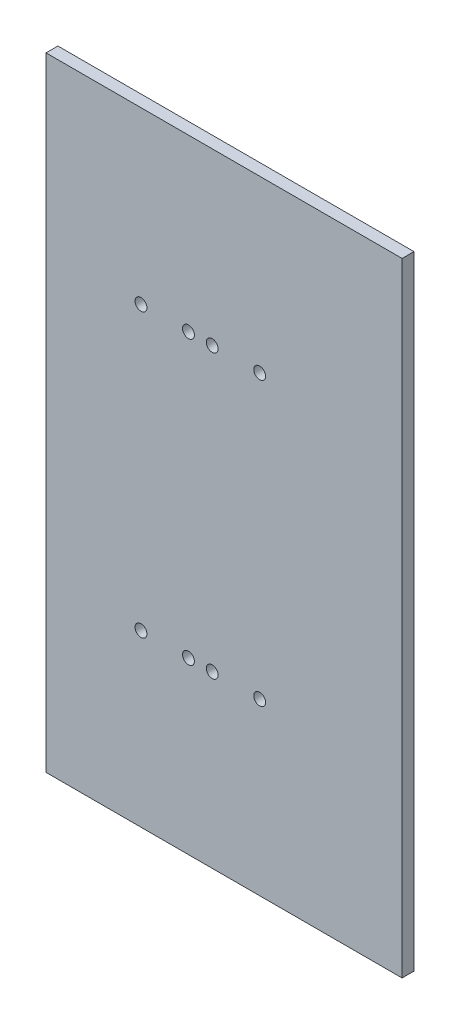
ISO-10303-21;
HEADER;
FILE_DESCRIPTION(('STEP AP214'),'2;1');
FILE_NAME('part.step','',(''),(''),'','','');
FILE_SCHEMA(('AUTOMOTIVE_DESIGN { 1 0 10303 214 1 1 1 1 }'));
ENDSEC;
DATA;
#1=APPLICATION_CONTEXT('core data for automotive mechanical design processes');
#2=APPLICATION_PROTOCOL_DEFINITION('international standard','automotive_design',2000,#1);
#3=PRODUCT_CONTEXT('',#1,'mechanical');
#4=PRODUCT('Part','Part','',(#3));
#5=PRODUCT_RELATED_PRODUCT_CATEGORY('part','',(#4));
#6=PRODUCT_DEFINITION_FORMATION('','',#4);
#7=PRODUCT_DEFINITION_CONTEXT('part definition',#1,'design');
#8=PRODUCT_DEFINITION('design','',#6,#7);
#9=PRODUCT_DEFINITION_SHAPE('','',#8);
#10=(LENGTH_UNIT() NAMED_UNIT(*) SI_UNIT(.MILLI.,.METRE.));
#11=(NAMED_UNIT(*) PLANE_ANGLE_UNIT() SI_UNIT($,.RADIAN.));
#12=(NAMED_UNIT(*) SI_UNIT($,.STERADIAN.) SOLID_ANGLE_UNIT());
#13=UNCERTAINTY_MEASURE_WITH_UNIT(LENGTH_MEASURE(1.E-05),#10,'distance_accuracy_value','');
#14=(GEOMETRIC_REPRESENTATION_CONTEXT(3) GLOBAL_UNCERTAINTY_ASSIGNED_CONTEXT((#13)) GLOBAL_UNIT_ASSIGNED_CONTEXT((#10,
#11,#12)) REPRESENTATION_CONTEXT('',''));
#15=CARTESIAN_POINT('',(0.,0.,0.));
#16=DIRECTION('',(0.,0.,1.));
#17=DIRECTION('',(1.,0.,0.));
#18=AXIS2_PLACEMENT_3D('',#15,#16,#17);
#19=CARTESIAN_POINT('',(0.,0.,2.));
#20=DIRECTION('',(0.,0.,1.));
#21=DIRECTION('',(1.,0.,0.));
#22=AXIS2_PLACEMENT_3D('',#19,#20,#21);
#23=PLANE('',#22);
#24=CARTESIAN_POINT('',(-8.97183195623916,-33.2874476987448,2.));
#25=DIRECTION('',(0.,0.,1.));
#26=DIRECTION('',(1.,0.,0.));
#27=AXIS2_PLACEMENT_3D('',#24,#25,#26);
#28=CIRCLE('',#27,1.);
#29=CARTESIAN_POINT('',(-7.97183195623916,-33.2874476987448,2.));
#30=VERTEX_POINT('',#29);
#31=EDGE_CURVE('E144',#30,#30,#28,.T.);
#32=ORIENTED_EDGE('',*,*,#31,.F.);
#33=EDGE_LOOP('',(#32));
#34=FACE_BOUND('',#33,.T.);
#35=CARTESIAN_POINT('',(-8.97183195623916,14.3125523012552,2.));
#36=DIRECTION('',(0.,0.,1.));
#37=DIRECTION('',(1.,0.,0.));
#38=AXIS2_PLACEMENT_3D('',#35,#36,#37);
#39=CIRCLE('',#38,1.);
#40=CARTESIAN_POINT('',(-7.97183195623916,14.3125523012552,2.));
#41=VERTEX_POINT('',#40);
#42=EDGE_CURVE('E132',#41,#41,#39,.T.);
#43=ORIENTED_EDGE('',*,*,#42,.F.);
#44=EDGE_LOOP('',(#43));
#45=FACE_BOUND('',#44,.T.);
#46=CARTESIAN_POINT('',(-12.9718319562392,-33.2874476987448,2.));
#47=DIRECTION('',(0.,0.,1.));
#48=DIRECTION('',(1.,0.,0.));
#49=AXIS2_PLACEMENT_3D('',#46,#47,#48);
#50=CIRCLE('',#49,1.);
#51=CARTESIAN_POINT('',(-11.9718319562392,-33.2874476987448,2.));
#52=VERTEX_POINT('',#51);
#53=EDGE_CURVE('E120',#52,#52,#50,.T.);
#54=ORIENTED_EDGE('',*,*,#53,.F.);
#55=EDGE_LOOP('',(#54));
#56=FACE_BOUND('',#55,.T.);
#57=CARTESIAN_POINT('',(-20.9718319562391,-33.2874476987448,2.));
#58=DIRECTION('',(0.,0.,1.));
#59=DIRECTION('',(1.,0.,0.));
#60=AXIS2_PLACEMENT_3D('',#57,#58,#59);
#61=CIRCLE('',#60,1.00000000000001);
#62=CARTESIAN_POINT('',(-19.9718319562391,-33.2874476987448,2.));
#63=VERTEX_POINT('',#62);
#64=EDGE_CURVE('E99',#63,#63,#61,.T.);
#65=ORIENTED_EDGE('',*,*,#64,.F.);
#66=EDGE_LOOP('',(#65));
#67=FACE_BOUND('',#66,.T.);
#68=DIRECTION('',(0.,-1.,0.));
#69=VECTOR('',#68,1.);
#70=CARTESIAN_POINT('',(-36.9718319562392,43.0125523012552,2.));
#71=LINE('',#70,#69);
#72=CARTESIAN_POINT('',(-36.9718319562392,43.0125523012552,2.));
#73=VERTEX_POINT('',#72);
#74=CARTESIAN_POINT('',(-36.9718319562392,-61.9874476987448,2.));
#75=VERTEX_POINT('',#74);
#76=EDGE_CURVE('E84',#73,#75,#71,.T.);
#77=ORIENTED_EDGE('',*,*,#76,.T.);
#78=DIRECTION('',(1.,0.,0.));
#79=VECTOR('',#78,1.);
#80=CARTESIAN_POINT('',(-36.9718319562392,-61.9874476987448,2.));
#81=LINE('',#80,#79);
#82=CARTESIAN_POINT('',(23.0281680437608,-61.9874476987448,2.));
#83=VERTEX_POINT('',#82);
#84=EDGE_CURVE('E79',#75,#83,#81,.T.);
#85=ORIENTED_EDGE('',*,*,#84,.T.);
#86=DIRECTION('',(0.,1.,0.));
#87=VECTOR('',#86,1.);
#88=CARTESIAN_POINT('',(23.0281680437608,43.0125523012552,2.));
#89=LINE('',#88,#87);
#90=CARTESIAN_POINT('',(23.0281680437608,43.0125523012552,2.));
#91=VERTEX_POINT('',#90);
#92=EDGE_CURVE('E82',#83,#91,#89,.T.);
#93=ORIENTED_EDGE('',*,*,#92,.T.);
#94=DIRECTION('',(-1.,0.,0.));
#95=VECTOR('',#94,1.);
#96=CARTESIAN_POINT('',(-36.9718319562392,43.0125523012552,2.));
#97=LINE('',#96,#95);
#98=EDGE_CURVE('E49',#91,#73,#97,.T.);
#99=ORIENTED_EDGE('',*,*,#98,.T.);
#100=EDGE_LOOP('',(#77,#85,#93,#99));
#101=FACE_BOUND('',#100,.T.);
#102=CARTESIAN_POINT('',(-20.9718319562391,14.3125523012552,2.));
#103=DIRECTION('',(0.,0.,1.));
#104=DIRECTION('',(1.,0.,0.));
#105=AXIS2_PLACEMENT_3D('',#102,#103,#104);
#106=CIRCLE('',#105,1.00000000000001);
#107=CARTESIAN_POINT('',(-19.9718319562391,14.3125523012552,2.));
#108=VERTEX_POINT('',#107);
#109=EDGE_CURVE('E114',#108,#108,#106,.T.);
#110=ORIENTED_EDGE('',*,*,#109,.F.);
#111=EDGE_LOOP('',(#110));
#112=FACE_BOUND('',#111,.T.);
#113=CARTESIAN_POINT('',(-12.9718319562392,14.3125523012552,2.));
#114=DIRECTION('',(0.,0.,1.));
#115=DIRECTION('',(1.,0.,0.));
#116=AXIS2_PLACEMENT_3D('',#113,#114,#115);
#117=CIRCLE('',#116,1.);
#118=CARTESIAN_POINT('',(-11.9718319562392,14.3125523012552,2.));
#119=VERTEX_POINT('',#118);
#120=EDGE_CURVE('E126',#119,#119,#117,.T.);
#121=ORIENTED_EDGE('',*,*,#120,.F.);
#122=EDGE_LOOP('',(#121));
#123=FACE_BOUND('',#122,.T.);
#124=CARTESIAN_POINT('',(-0.971831956239179,14.3125523012552,2.));
#125=DIRECTION('',(0.,0.,1.));
#126=DIRECTION('',(1.,0.,0.));
#127=AXIS2_PLACEMENT_3D('',#124,#125,#126);
#128=CIRCLE('',#127,1.);
#129=CARTESIAN_POINT('',(0.0281680437608234,14.3125523012552,2.));
#130=VERTEX_POINT('',#129);
#131=EDGE_CURVE('E138',#130,#130,#128,.T.);
#132=ORIENTED_EDGE('',*,*,#131,.F.);
#133=EDGE_LOOP('',(#132));
#134=FACE_BOUND('',#133,.T.);
#135=CARTESIAN_POINT('',(-0.971831956239179,-33.2874476987448,2.));
#136=DIRECTION('',(0.,0.,1.));
#137=DIRECTION('',(1.,0.,0.));
#138=AXIS2_PLACEMENT_3D('',#135,#136,#137);
#139=CIRCLE('',#138,1.);
#140=CARTESIAN_POINT('',(0.0281680437608234,-33.2874476987448,2.));
#141=VERTEX_POINT('',#140);
#142=EDGE_CURVE('E150',#141,#141,#139,.T.);
#143=ORIENTED_EDGE('',*,*,#142,.F.);
#144=EDGE_LOOP('',(#143));
#145=FACE_BOUND('',#144,.T.);
#146=ADVANCED_FACE('F32',(#34,#45,#56,#67,#101,#112,#123,#134,#145),#23,.T.);
#147=CARTESIAN_POINT('',(0.,0.,0.));
#148=DIRECTION('',(0.,0.,1.));
#149=DIRECTION('',(1.,0.,0.));
#150=AXIS2_PLACEMENT_3D('',#147,#148,#149);
#151=PLANE('',#150);
#152=DIRECTION('',(0.,-1.,0.));
#153=VECTOR('',#152,1.);
#154=CARTESIAN_POINT('',(-36.9718319562392,43.0125523012552,0.));
#155=LINE('',#154,#153);
#156=CARTESIAN_POINT('',(-36.9718319562392,43.0125523012552,0.));
#157=VERTEX_POINT('',#156);
#158=CARTESIAN_POINT('',(-36.9718319562392,-61.9874476987448,0.));
#159=VERTEX_POINT('',#158);
#160=EDGE_CURVE('E96',#157,#159,#155,.T.);
#161=ORIENTED_EDGE('',*,*,#160,.F.);
#162=DIRECTION('',(-1.,0.,0.));
#163=VECTOR('',#162,1.);
#164=CARTESIAN_POINT('',(-36.9718319562392,43.0125523012552,0.));
#165=LINE('',#164,#163);
#166=CARTESIAN_POINT('',(23.0281680437608,43.0125523012552,0.));
#167=VERTEX_POINT('',#166);
#168=EDGE_CURVE('E72',#167,#157,#165,.T.);
#169=ORIENTED_EDGE('',*,*,#168,.F.);
#170=DIRECTION('',(0.,1.,0.));
#171=VECTOR('',#170,1.);
#172=CARTESIAN_POINT('',(23.0281680437608,43.0125523012552,0.));
#173=LINE('',#172,#171);
#174=CARTESIAN_POINT('',(23.0281680437608,-61.9874476987448,0.));
#175=VERTEX_POINT('',#174);
#176=EDGE_CURVE('E66',#175,#167,#173,.T.);
#177=ORIENTED_EDGE('',*,*,#176,.F.);
#178=DIRECTION('',(1.,0.,0.));
#179=VECTOR('',#178,1.);
#180=CARTESIAN_POINT('',(-36.9718319562392,-61.9874476987448,0.));
#181=LINE('',#180,#179);
#182=EDGE_CURVE('E88',#159,#175,#181,.T.);
#183=ORIENTED_EDGE('',*,*,#182,.F.);
#184=EDGE_LOOP('',(#161,#169,#177,#183));
#185=FACE_BOUND('',#184,.T.);
#186=CARTESIAN_POINT('',(-20.9718319562391,-33.2874476987448,0.));
#187=DIRECTION('',(0.,0.,1.));
#188=DIRECTION('',(1.,0.,0.));
#189=AXIS2_PLACEMENT_3D('',#186,#187,#188);
#190=CIRCLE('',#189,1.00000000000001);
#191=CARTESIAN_POINT('',(-19.9718319562391,-33.2874476987448,0.));
#192=VERTEX_POINT('',#191);
#193=EDGE_CURVE('E111',#192,#192,#190,.T.);
#194=ORIENTED_EDGE('',*,*,#193,.T.);
#195=EDGE_LOOP('',(#194));
#196=FACE_BOUND('',#195,.T.);
#197=CARTESIAN_POINT('',(-20.9718319562391,14.3125523012552,0.));
#198=DIRECTION('',(0.,0.,1.));
#199=DIRECTION('',(1.,0.,0.));
#200=AXIS2_PLACEMENT_3D('',#197,#198,#199);
#201=CIRCLE('',#200,1.00000000000001);
#202=CARTESIAN_POINT('',(-19.9718319562391,14.3125523012552,0.));
#203=VERTEX_POINT('',#202);
#204=EDGE_CURVE('E117',#203,#203,#201,.T.);
#205=ORIENTED_EDGE('',*,*,#204,.T.);
#206=EDGE_LOOP('',(#205));
#207=FACE_BOUND('',#206,.T.);
#208=CARTESIAN_POINT('',(-12.9718319562392,-33.2874476987448,0.));
#209=DIRECTION('',(0.,0.,1.));
#210=DIRECTION('',(1.,0.,0.));
#211=AXIS2_PLACEMENT_3D('',#208,#209,#210);
#212=CIRCLE('',#211,1.);
#213=CARTESIAN_POINT('',(-11.9718319562392,-33.2874476987448,0.));
#214=VERTEX_POINT('',#213);
#215=EDGE_CURVE('E123',#214,#214,#212,.T.);
#216=ORIENTED_EDGE('',*,*,#215,.T.);
#217=EDGE_LOOP('',(#216));
#218=FACE_BOUND('',#217,.T.);
#219=CARTESIAN_POINT('',(-12.9718319562392,14.3125523012552,0.));
#220=DIRECTION('',(0.,0.,1.));
#221=DIRECTION('',(1.,0.,0.));
#222=AXIS2_PLACEMENT_3D('',#219,#220,#221);
#223=CIRCLE('',#222,1.);
#224=CARTESIAN_POINT('',(-11.9718319562392,14.3125523012552,0.));
#225=VERTEX_POINT('',#224);
#226=EDGE_CURVE('E129',#225,#225,#223,.T.);
#227=ORIENTED_EDGE('',*,*,#226,.T.);
#228=EDGE_LOOP('',(#227));
#229=FACE_BOUND('',#228,.T.);
#230=CARTESIAN_POINT('',(-8.97183195623916,14.3125523012552,0.));
#231=DIRECTION('',(0.,0.,1.));
#232=DIRECTION('',(1.,0.,0.));
#233=AXIS2_PLACEMENT_3D('',#230,#231,#232);
#234=CIRCLE('',#233,1.);
#235=CARTESIAN_POINT('',(-7.97183195623916,14.3125523012552,0.));
#236=VERTEX_POINT('',#235);
#237=EDGE_CURVE('E135',#236,#236,#234,.T.);
#238=ORIENTED_EDGE('',*,*,#237,.T.);
#239=EDGE_LOOP('',(#238));
#240=FACE_BOUND('',#239,.T.);
#241=CARTESIAN_POINT('',(-0.971831956239179,14.3125523012552,0.));
#242=DIRECTION('',(0.,0.,1.));
#243=DIRECTION('',(1.,0.,0.));
#244=AXIS2_PLACEMENT_3D('',#241,#242,#243);
#245=CIRCLE('',#244,1.);
#246=CARTESIAN_POINT('',(0.0281680437608234,14.3125523012552,0.));
#247=VERTEX_POINT('',#246);
#248=EDGE_CURVE('E141',#247,#247,#245,.T.);
#249=ORIENTED_EDGE('',*,*,#248,.T.);
#250=EDGE_LOOP('',(#249));
#251=FACE_BOUND('',#250,.T.);
#252=CARTESIAN_POINT('',(-8.97183195623916,-33.2874476987448,0.));
#253=DIRECTION('',(0.,0.,1.));
#254=DIRECTION('',(1.,0.,0.));
#255=AXIS2_PLACEMENT_3D('',#252,#253,#254);
#256=CIRCLE('',#255,1.);
#257=CARTESIAN_POINT('',(-7.97183195623916,-33.2874476987448,0.));
#258=VERTEX_POINT('',#257);
#259=EDGE_CURVE('E147',#258,#258,#256,.T.);
#260=ORIENTED_EDGE('',*,*,#259,.T.);
#261=EDGE_LOOP('',(#260));
#262=FACE_BOUND('',#261,.T.);
#263=CARTESIAN_POINT('',(-0.971831956239179,-33.2874476987448,0.));
#264=DIRECTION('',(0.,0.,1.));
#265=DIRECTION('',(1.,0.,0.));
#266=AXIS2_PLACEMENT_3D('',#263,#264,#265);
#267=CIRCLE('',#266,1.);
#268=CARTESIAN_POINT('',(0.0281680437608234,-33.2874476987448,0.));
#269=VERTEX_POINT('',#268);
#270=EDGE_CURVE('E153',#269,#269,#267,.T.);
#271=ORIENTED_EDGE('',*,*,#270,.T.);
#272=EDGE_LOOP('',(#271));
#273=FACE_BOUND('',#272,.T.);
#274=ADVANCED_FACE('F107',(#185,#196,#207,#218,#229,#240,#251,#262,#273),#151,.F.);
#275=CARTESIAN_POINT('',(-36.9718319562392,43.0125523012552,2.));
#276=DIRECTION('',(1.,0.,0.));
#277=DIRECTION('',(0.,0.,-1.));
#278=AXIS2_PLACEMENT_3D('',#275,#276,#277);
#279=PLANE('',#278);
#280=ORIENTED_EDGE('',*,*,#160,.T.);
#281=DIRECTION('',(0.,0.,-1.));
#282=VECTOR('',#281,1.);
#283=CARTESIAN_POINT('',(-36.9718319562392,-61.9874476987448,2.));
#284=LINE('',#283,#282);
#285=EDGE_CURVE('E11',#75,#159,#284,.T.);
#286=ORIENTED_EDGE('',*,*,#285,.F.);
#287=ORIENTED_EDGE('',*,*,#76,.F.);
#288=DIRECTION('',(0.,0.,-1.));
#289=VECTOR('',#288,1.);
#290=CARTESIAN_POINT('',(-36.9718319562392,43.0125523012552,2.));
#291=LINE('',#290,#289);
#292=EDGE_CURVE('E92',#73,#157,#291,.T.);
#293=ORIENTED_EDGE('',*,*,#292,.T.);
#294=EDGE_LOOP('',(#280,#286,#287,#293));
#295=FACE_BOUND('',#294,.T.);
#296=ADVANCED_FACE('F34',(#295),#279,.F.);
#297=CARTESIAN_POINT('',(-36.9718319562392,-61.9874476987448,2.));
#298=DIRECTION('',(0.,1.,0.));
#299=DIRECTION('',(0.,0.,1.));
#300=AXIS2_PLACEMENT_3D('',#297,#298,#299);
#301=PLANE('',#300);
#302=ORIENTED_EDGE('',*,*,#182,.T.);
#303=DIRECTION('',(0.,0.,-1.));
#304=VECTOR('',#303,1.);
#305=CARTESIAN_POINT('',(23.0281680437608,-61.9874476987448,2.));
#306=LINE('',#305,#304);
#307=EDGE_CURVE('E41',#83,#175,#306,.T.);
#308=ORIENTED_EDGE('',*,*,#307,.F.);
#309=ORIENTED_EDGE('',*,*,#84,.F.);
#310=ORIENTED_EDGE('',*,*,#285,.T.);
#311=EDGE_LOOP('',(#302,#308,#309,#310));
#312=FACE_BOUND('',#311,.T.);
#313=ADVANCED_FACE('F87',(#312),#301,.F.);
#314=CARTESIAN_POINT('',(23.0281680437608,43.0125523012552,2.));
#315=DIRECTION('',(-1.,0.,0.));
#316=DIRECTION('',(0.,0.,1.));
#317=AXIS2_PLACEMENT_3D('',#314,#315,#316);
#318=PLANE('',#317);
#319=ORIENTED_EDGE('',*,*,#176,.T.);
#320=DIRECTION('',(0.,0.,-1.));
#321=VECTOR('',#320,1.);
#322=CARTESIAN_POINT('',(23.0281680437608,43.0125523012552,2.));
#323=LINE('',#322,#321);
#324=EDGE_CURVE('E89',#91,#167,#323,.T.);
#325=ORIENTED_EDGE('',*,*,#324,.F.);
#326=ORIENTED_EDGE('',*,*,#92,.F.);
#327=ORIENTED_EDGE('',*,*,#307,.T.);
#328=EDGE_LOOP('',(#319,#325,#326,#327));
#329=FACE_BOUND('',#328,.T.);
#330=ADVANCED_FACE('F90',(#329),#318,.F.);
#331=CARTESIAN_POINT('',(-36.9718319562392,43.0125523012552,2.));
#332=DIRECTION('',(0.,-1.,0.));
#333=DIRECTION('',(0.,0.,-1.));
#334=AXIS2_PLACEMENT_3D('',#331,#332,#333);
#335=PLANE('',#334);
#336=ORIENTED_EDGE('',*,*,#168,.T.);
#337=ORIENTED_EDGE('',*,*,#292,.F.);
#338=ORIENTED_EDGE('',*,*,#98,.F.);
#339=ORIENTED_EDGE('',*,*,#324,.T.);
#340=EDGE_LOOP('',(#336,#337,#338,#339));
#341=FACE_BOUND('',#340,.T.);
#342=ADVANCED_FACE('F104',(#341),#335,.F.);
#343=CARTESIAN_POINT('',(-20.9718319562391,-33.2874476987448,2.));
#344=DIRECTION('',(0.,0.,-1.));
#345=DIRECTION('',(-1.,0.,0.));
#346=AXIS2_PLACEMENT_3D('',#343,#344,#345);
#347=CYLINDRICAL_SURFACE('',#346,1.00000000000001);
#348=ORIENTED_EDGE('',*,*,#64,.T.);
#349=EDGE_LOOP('',(#348));
#350=FACE_BOUND('',#349,.T.);
#351=ORIENTED_EDGE('',*,*,#193,.F.);
#352=EDGE_LOOP('',(#351));
#353=FACE_BOUND('',#352,.T.);
#354=ADVANCED_FACE('F172',(#350,#353),#347,.F.);
#355=CARTESIAN_POINT('',(-20.9718319562391,14.3125523012552,2.));
#356=DIRECTION('',(0.,0.,-1.));
#357=DIRECTION('',(-1.,0.,0.));
#358=AXIS2_PLACEMENT_3D('',#355,#356,#357);
#359=CYLINDRICAL_SURFACE('',#358,1.00000000000001);
#360=ORIENTED_EDGE('',*,*,#109,.T.);
#361=EDGE_LOOP('',(#360));
#362=FACE_BOUND('',#361,.T.);
#363=ORIENTED_EDGE('',*,*,#204,.F.);
#364=EDGE_LOOP('',(#363));
#365=FACE_BOUND('',#364,.T.);
#366=ADVANCED_FACE('F218',(#362,#365),#359,.F.);
#367=CARTESIAN_POINT('',(-12.9718319562392,-33.2874476987448,2.));
#368=DIRECTION('',(0.,0.,-1.));
#369=DIRECTION('',(-1.,0.,0.));
#370=AXIS2_PLACEMENT_3D('',#367,#368,#369);
#371=CYLINDRICAL_SURFACE('',#370,1.);
#372=ORIENTED_EDGE('',*,*,#53,.T.);
#373=EDGE_LOOP('',(#372));
#374=FACE_BOUND('',#373,.T.);
#375=ORIENTED_EDGE('',*,*,#215,.F.);
#376=EDGE_LOOP('',(#375));
#377=FACE_BOUND('',#376,.T.);
#378=ADVANCED_FACE('F226',(#374,#377),#371,.F.);
#379=CARTESIAN_POINT('',(-12.9718319562392,14.3125523012552,2.));
#380=DIRECTION('',(0.,0.,-1.));
#381=DIRECTION('',(-1.,0.,0.));
#382=AXIS2_PLACEMENT_3D('',#379,#380,#381);
#383=CYLINDRICAL_SURFACE('',#382,1.);
#384=ORIENTED_EDGE('',*,*,#120,.T.);
#385=EDGE_LOOP('',(#384));
#386=FACE_BOUND('',#385,.T.);
#387=ORIENTED_EDGE('',*,*,#226,.F.);
#388=EDGE_LOOP('',(#387));
#389=FACE_BOUND('',#388,.T.);
#390=ADVANCED_FACE('F234',(#386,#389),#383,.F.);
#391=CARTESIAN_POINT('',(-8.97183195623916,14.3125523012552,2.));
#392=DIRECTION('',(0.,0.,-1.));
#393=DIRECTION('',(-1.,0.,0.));
#394=AXIS2_PLACEMENT_3D('',#391,#392,#393);
#395=CYLINDRICAL_SURFACE('',#394,1.);
#396=ORIENTED_EDGE('',*,*,#42,.T.);
#397=EDGE_LOOP('',(#396));
#398=FACE_BOUND('',#397,.T.);
#399=ORIENTED_EDGE('',*,*,#237,.F.);
#400=EDGE_LOOP('',(#399));
#401=FACE_BOUND('',#400,.T.);
#402=ADVANCED_FACE('F243',(#398,#401),#395,.F.);
#403=CARTESIAN_POINT('',(-0.971831956239179,14.3125523012552,2.));
#404=DIRECTION('',(0.,0.,-1.));
#405=DIRECTION('',(-1.,0.,0.));
#406=AXIS2_PLACEMENT_3D('',#403,#404,#405);
#407=CYLINDRICAL_SURFACE('',#406,1.);
#408=ORIENTED_EDGE('',*,*,#131,.T.);
#409=EDGE_LOOP('',(#408));
#410=FACE_BOUND('',#409,.T.);
#411=ORIENTED_EDGE('',*,*,#248,.F.);
#412=EDGE_LOOP('',(#411));
#413=FACE_BOUND('',#412,.T.);
#414=ADVANCED_FACE('F252',(#410,#413),#407,.F.);
#415=CARTESIAN_POINT('',(-8.97183195623916,-33.2874476987448,2.));
#416=DIRECTION('',(0.,0.,-1.));
#417=DIRECTION('',(-1.,0.,0.));
#418=AXIS2_PLACEMENT_3D('',#415,#416,#417);
#419=CYLINDRICAL_SURFACE('',#418,1.);
#420=ORIENTED_EDGE('',*,*,#31,.T.);
#421=EDGE_LOOP('',(#420));
#422=FACE_BOUND('',#421,.T.);
#423=ORIENTED_EDGE('',*,*,#259,.F.);
#424=EDGE_LOOP('',(#423));
#425=FACE_BOUND('',#424,.T.);
#426=ADVANCED_FACE('F261',(#422,#425),#419,.F.);
#427=CARTESIAN_POINT('',(-0.971831956239179,-33.2874476987448,2.));
#428=DIRECTION('',(0.,0.,-1.));
#429=DIRECTION('',(-1.,0.,0.));
#430=AXIS2_PLACEMENT_3D('',#427,#428,#429);
#431=CYLINDRICAL_SURFACE('',#430,1.);
#432=ORIENTED_EDGE('',*,*,#142,.T.);
#433=EDGE_LOOP('',(#432));
#434=FACE_BOUND('',#433,.T.);
#435=ORIENTED_EDGE('',*,*,#270,.F.);
#436=EDGE_LOOP('',(#435));
#437=FACE_BOUND('',#436,.T.);
#438=ADVANCED_FACE('F159',(#434,#437),#431,.F.);
#439=CLOSED_SHELL('',(#146,#274,#296,#313,#330,#342,#354,#366,#378,#390,#402,#414,#426,#438));
#440=MANIFOLD_SOLID_BREP('B2',#439);
#441=ADVANCED_BREP_SHAPE_REPRESENTATION('',(#18,#440),#14);
#442=SHAPE_DEFINITION_REPRESENTATION(#9,#441);
ENDSEC;
END-ISO-10303-21;
